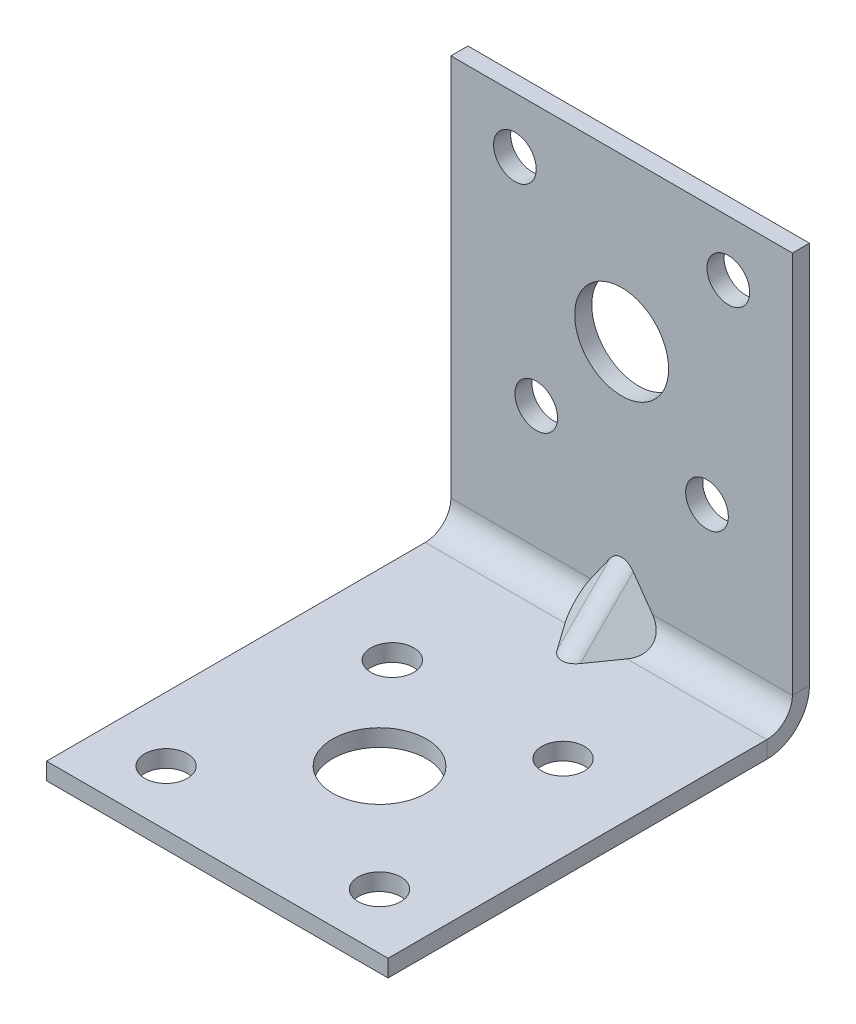
ISO-10303-21;
HEADER;
FILE_DESCRIPTION(('STEP AP214'),'2;1');
FILE_NAME('part.step','',(''),(''),'','','');
FILE_SCHEMA(('AUTOMOTIVE_DESIGN { 1 0 10303 214 1 1 1 1 }'));
ENDSEC;
DATA;
#1=APPLICATION_CONTEXT('core data for automotive mechanical design processes');
#2=APPLICATION_PROTOCOL_DEFINITION('international standard','automotive_design',2000,#1);
#3=PRODUCT_CONTEXT('',#1,'mechanical');
#4=PRODUCT('Part','Part','',(#3));
#5=PRODUCT_RELATED_PRODUCT_CATEGORY('part','',(#4));
#6=PRODUCT_DEFINITION_FORMATION('','',#4);
#7=PRODUCT_DEFINITION_CONTEXT('part definition',#1,'design');
#8=PRODUCT_DEFINITION('design','',#6,#7);
#9=PRODUCT_DEFINITION_SHAPE('','',#8);
#10=(LENGTH_UNIT() NAMED_UNIT(*) SI_UNIT(.MILLI.,.METRE.));
#11=(NAMED_UNIT(*) PLANE_ANGLE_UNIT() SI_UNIT($,.RADIAN.));
#12=(NAMED_UNIT(*) SI_UNIT($,.STERADIAN.) SOLID_ANGLE_UNIT());
#13=UNCERTAINTY_MEASURE_WITH_UNIT(LENGTH_MEASURE(1.E-05),#10,'distance_accuracy_value','');
#14=(GEOMETRIC_REPRESENTATION_CONTEXT(3) GLOBAL_UNCERTAINTY_ASSIGNED_CONTEXT((#13)) GLOBAL_UNIT_ASSIGNED_CONTEXT((#10,
#11,#12)) REPRESENTATION_CONTEXT('',''));
#15=CARTESIAN_POINT('',(0.,0.,0.));
#16=DIRECTION('',(0.,0.,1.));
#17=DIRECTION('',(1.,0.,0.));
#18=AXIS2_PLACEMENT_3D('',#15,#16,#17);
#19=CARTESIAN_POINT('',(0.,0.108407346410232,-1.60840734641019));
#20=DIRECTION('',(0.,0.,-1.));
#21=DIRECTION('',(0.,1.,0.));
#22=AXIS2_PLACEMENT_3D('',#19,#20,#21);
#23=PLANE('',#22);
#24=CARTESIAN_POINT('',(10.,17.3584073464102,-1.60840734641019));
#25=DIRECTION('',(0.,0.,1.));
#26=DIRECTION('',(1.,0.,0.));
#27=AXIS2_PLACEMENT_3D('',#24,#25,#26);
#28=CIRCLE('',#27,2.5);
#29=CARTESIAN_POINT('',(12.5,17.3584073464102,-1.60840734641019));
#30=VERTEX_POINT('',#29);
#31=EDGE_CURVE('E272',#30,#30,#28,.T.);
#32=ORIENTED_EDGE('',*,*,#31,.T.);
#33=EDGE_LOOP('',(#32));
#34=FACE_BOUND('',#33,.T.);
#35=CARTESIAN_POINT('',(-10.,17.3584073464102,-1.60840734641019));
#36=DIRECTION('',(0.,0.,1.));
#37=DIRECTION('',(1.,0.,0.));
#38=AXIS2_PLACEMENT_3D('',#35,#36,#37);
#39=CIRCLE('',#38,2.5);
#40=CARTESIAN_POINT('',(-7.5,17.3584073464102,-1.60840734641019));
#41=VERTEX_POINT('',#40);
#42=EDGE_CURVE('E297',#41,#41,#39,.T.);
#43=ORIENTED_EDGE('',*,*,#42,.T.);
#44=EDGE_LOOP('',(#43));
#45=FACE_BOUND('',#44,.T.);
#46=CARTESIAN_POINT('',(-12.5,41.3584073464102,-1.60840734641019));
#47=DIRECTION('',(0.,0.,1.));
#48=DIRECTION('',(1.,0.,0.));
#49=AXIS2_PLACEMENT_3D('',#46,#47,#48);
#50=CIRCLE('',#49,2.5);
#51=CARTESIAN_POINT('',(-10.,41.3584073464102,-1.60840734641019));
#52=VERTEX_POINT('',#51);
#53=EDGE_CURVE('E289',#52,#52,#50,.T.);
#54=ORIENTED_EDGE('',*,*,#53,.T.);
#55=EDGE_LOOP('',(#54));
#56=FACE_BOUND('',#55,.T.);
#57=CARTESIAN_POINT('',(12.5,41.3584073464102,-1.60840734641019));
#58=DIRECTION('',(0.,0.,1.));
#59=DIRECTION('',(1.,0.,0.));
#60=AXIS2_PLACEMENT_3D('',#57,#58,#59);
#61=CIRCLE('',#60,2.5);
#62=CARTESIAN_POINT('',(15.,41.3584073464102,-1.60840734641019));
#63=VERTEX_POINT('',#62);
#64=EDGE_CURVE('E281',#63,#63,#61,.T.);
#65=ORIENTED_EDGE('',*,*,#64,.T.);
#66=EDGE_LOOP('',(#65));
#67=FACE_BOUND('',#66,.T.);
#68=CARTESIAN_POINT('',(0.,28.8584073464102,-1.60840734641019));
#69=DIRECTION('',(0.,0.,1.));
#70=DIRECTION('',(1.,0.,0.));
#71=AXIS2_PLACEMENT_3D('',#68,#69,#70);
#72=CIRCLE('',#71,5.5);
#73=CARTESIAN_POINT('',(5.5,28.8584073464102,-1.60840734641019));
#74=VERTEX_POINT('',#73);
#75=EDGE_CURVE('E308',#74,#74,#72,.T.);
#76=ORIENTED_EDGE('',*,*,#75,.T.);
#77=EDGE_LOOP('',(#76));
#78=FACE_BOUND('',#77,.T.);
#79=DIRECTION('',(1.,0.,0.));
#80=VECTOR('',#79,1.);
#81=CARTESIAN_POINT('',(0.,3.00000000000002,-1.60840734641018));
#82=LINE('',#81,#80);
#83=CARTESIAN_POINT('',(3.62867965644033,3.00000000000002,-1.60840734641018));
#84=VERTEX_POINT('',#83);
#85=CARTESIAN_POINT('',(20.,3.00000000000001,-1.60840734641019));
#86=VERTEX_POINT('',#85);
#87=EDGE_CURVE('E391',#84,#86,#82,.T.);
#88=ORIENTED_EDGE('',*,*,#87,.F.);
#89=DIRECTION('',(0.577350269189627,-0.816496580927725,0.));
#90=VECTOR('',#89,1.);
#91=CARTESIAN_POINT('',(3.78222962014858,2.78284755882192,-1.60840734641018));
#92=LINE('',#91,#90);
#93=CARTESIAN_POINT('',(0.659009742330239,7.19974746830585,-1.60840734641017));
#94=VERTEX_POINT('',#93);
#95=EDGE_CURVE('E195',#84,#94,#92,.F.);
#96=ORIENTED_EDGE('',*,*,#95,.T.);
#97=CARTESIAN_POINT('',(0.,6.26776695296642,-1.60840734641017));
#98=DIRECTION('',(0.,0.,-1.));
#99=DIRECTION('',(0.,-1.,0.));
#100=AXIS2_PLACEMENT_3D('',#97,#98,#99);
#101=ELLIPSE('',#100,1.31801948466048,0.931980515339427);
#102=CARTESIAN_POINT('',(-0.659009742330244,7.19974746830585,-1.60840734641017));
#103=VERTEX_POINT('',#102);
#104=EDGE_CURVE('E199',#103,#94,#101,.T.);
#105=ORIENTED_EDGE('',*,*,#104,.F.);
#106=DIRECTION('',(0.577350269189627,0.816496580927725,0.));
#107=VECTOR('',#106,1.);
#108=CARTESIAN_POINT('',(-3.78222962014859,2.78284755882193,-1.60840734641018));
#109=LINE('',#108,#107);
#110=CARTESIAN_POINT('',(-3.62867965644035,3.00000000000002,-1.60840734641018));
#111=VERTEX_POINT('',#110);
#112=EDGE_CURVE('E179',#111,#103,#109,.T.);
#113=ORIENTED_EDGE('',*,*,#112,.F.);
#114=CARTESIAN_POINT('',(-20.,3.00000000000002,-1.60840734641018));
#115=VERTEX_POINT('',#114);
#116=EDGE_CURVE('E396',#115,#111,#82,.T.);
#117=ORIENTED_EDGE('',*,*,#116,.F.);
#118=DIRECTION('',(0.,-1.,0.));
#119=VECTOR('',#118,1.);
#120=CARTESIAN_POINT('',(-20.,-47.6415926535898,-1.60840734641036));
#121=LINE('',#120,#119);
#122=CARTESIAN_POINT('',(-20.,47.8584073464102,-1.60840734641003));
#123=VERTEX_POINT('',#122);
#124=EDGE_CURVE('E381',#123,#115,#121,.T.);
#125=ORIENTED_EDGE('',*,*,#124,.F.);
#126=DIRECTION('',(-1.,0.,0.));
#127=VECTOR('',#126,1.);
#128=CARTESIAN_POINT('',(-20.,47.8584073464102,-1.60840734641003));
#129=LINE('',#128,#127);
#130=CARTESIAN_POINT('',(20.,47.8584073464102,-1.60840734641003));
#131=VERTEX_POINT('',#130);
#132=EDGE_CURVE('E377',#131,#123,#129,.T.);
#133=ORIENTED_EDGE('',*,*,#132,.F.);
#134=DIRECTION('',(0.,1.,0.));
#135=VECTOR('',#134,1.);
#136=CARTESIAN_POINT('',(20.,-47.6415926535898,-1.60840734641036));
#137=LINE('',#136,#135);
#138=EDGE_CURVE('E382',#86,#131,#137,.T.);
#139=ORIENTED_EDGE('',*,*,#138,.F.);
#140=EDGE_LOOP('',(#88,#96,#105,#113,#117,#125,#133,#139));
#141=FACE_BOUND('',#140,.T.);
#142=ADVANCED_FACE('F54',(#34,#45,#56,#67,#78,#141),#23,.T.);
#143=CARTESIAN_POINT('',(0.,-2.,0.));
#144=DIRECTION('',(0.,-1.,0.));
#145=DIRECTION('',(0.,0.,-1.));
#146=AXIS2_PLACEMENT_3D('',#143,#144,#145);
#147=PLANE('',#146);
#148=CARTESIAN_POINT('',(-12.5,-2.,41.25));
#149=DIRECTION('',(0.,1.,0.));
#150=DIRECTION('',(0.,0.,1.));
#151=AXIS2_PLACEMENT_3D('',#148,#149,#150);
#152=CIRCLE('',#151,2.5);
#153=CARTESIAN_POINT('',(-12.5,-2.,43.75));
#154=VERTEX_POINT('',#153);
#155=EDGE_CURVE('E235',#154,#154,#152,.T.);
#156=ORIENTED_EDGE('',*,*,#155,.T.);
#157=EDGE_LOOP('',(#156));
#158=FACE_BOUND('',#157,.T.);
#159=CARTESIAN_POINT('',(12.5,-2.,41.25));
#160=DIRECTION('',(0.,1.,0.));
#161=DIRECTION('',(0.,0.,1.));
#162=AXIS2_PLACEMENT_3D('',#159,#160,#161);
#163=CIRCLE('',#162,2.5);
#164=CARTESIAN_POINT('',(12.5,-2.,43.75));
#165=VERTEX_POINT('',#164);
#166=EDGE_CURVE('E257',#165,#165,#163,.T.);
#167=ORIENTED_EDGE('',*,*,#166,.T.);
#168=EDGE_LOOP('',(#167));
#169=FACE_BOUND('',#168,.T.);
#170=CARTESIAN_POINT('',(10.,-2.,17.25));
#171=DIRECTION('',(0.,1.,0.));
#172=DIRECTION('',(0.,0.,1.));
#173=AXIS2_PLACEMENT_3D('',#170,#171,#172);
#174=CIRCLE('',#173,2.5);
#175=CARTESIAN_POINT('',(10.,-2.,19.75));
#176=VERTEX_POINT('',#175);
#177=EDGE_CURVE('E249',#176,#176,#174,.T.);
#178=ORIENTED_EDGE('',*,*,#177,.T.);
#179=EDGE_LOOP('',(#178));
#180=FACE_BOUND('',#179,.T.);
#181=CARTESIAN_POINT('',(0.,-2.,28.75));
#182=DIRECTION('',(0.,1.,0.));
#183=DIRECTION('',(0.,0.,1.));
#184=AXIS2_PLACEMENT_3D('',#181,#182,#183);
#185=CIRCLE('',#184,5.5);
#186=CARTESIAN_POINT('',(0.,-2.,34.25));
#187=VERTEX_POINT('',#186);
#188=EDGE_CURVE('E241',#187,#187,#185,.T.);
#189=ORIENTED_EDGE('',*,*,#188,.T.);
#190=EDGE_LOOP('',(#189));
#191=FACE_BOUND('',#190,.T.);
#192=CARTESIAN_POINT('',(-10.,-2.,17.25));
#193=DIRECTION('',(0.,1.,0.));
#194=DIRECTION('',(0.,0.,1.));
#195=AXIS2_PLACEMENT_3D('',#192,#193,#194);
#196=CIRCLE('',#195,2.5);
#197=CARTESIAN_POINT('',(-10.,-2.,19.75));
#198=VERTEX_POINT('',#197);
#199=EDGE_CURVE('E268',#198,#198,#196,.T.);
#200=ORIENTED_EDGE('',*,*,#199,.T.);
#201=EDGE_LOOP('',(#200));
#202=FACE_BOUND('',#201,.T.);
#203=CARTESIAN_POINT('',(0.,-2.,6.65935960655622));
#204=DIRECTION('',(0.,-1.,0.));
#205=DIRECTION('',(0.,0.,1.));
#206=AXIS2_PLACEMENT_3D('',#203,#204,#205);
#207=ELLIPSE('',#206,1.31801948466048,0.931980515339427);
#208=CARTESIAN_POINT('',(0.659009742330239,-2.,7.59134012189565));
#209=VERTEX_POINT('',#208);
#210=CARTESIAN_POINT('',(-0.659009742330245,-2.,7.59134012189564));
#211=VERTEX_POINT('',#210);
#212=EDGE_CURVE('E13',#209,#211,#207,.T.);
#213=ORIENTED_EDGE('',*,*,#212,.F.);
#214=DIRECTION('',(-0.577350269189627,0.,0.816496580927725));
#215=VECTOR('',#214,1.);
#216=CARTESIAN_POINT('',(4.01793188054411,-2.,2.84110687907837));
#217=LINE('',#216,#215);
#218=CARTESIAN_POINT('',(3.62867965644033,-2.,3.39159265358981));
#219=VERTEX_POINT('',#218);
#220=EDGE_CURVE('E189',#209,#219,#217,.F.);
#221=ORIENTED_EDGE('',*,*,#220,.T.);
#222=DIRECTION('',(1.,0.,0.));
#223=VECTOR('',#222,1.);
#224=CARTESIAN_POINT('',(0.,-2.,3.39159265358981));
#225=LINE('',#224,#223);
#226=CARTESIAN_POINT('',(20.,-2.,3.39159265358981));
#227=VERTEX_POINT('',#226);
#228=EDGE_CURVE('E365',#219,#227,#225,.T.);
#229=ORIENTED_EDGE('',*,*,#228,.T.);
#230=DIRECTION('',(0.,0.,-1.));
#231=VECTOR('',#230,1.);
#232=CARTESIAN_POINT('',(20.,-2.,47.75));
#233=LINE('',#232,#231);
#234=CARTESIAN_POINT('',(20.,-2.,47.75));
#235=VERTEX_POINT('',#234);
#236=EDGE_CURVE('E359',#235,#227,#233,.T.);
#237=ORIENTED_EDGE('',*,*,#236,.F.);
#238=DIRECTION('',(1.,0.,0.));
#239=VECTOR('',#238,1.);
#240=CARTESIAN_POINT('',(-20.,-2.,47.75));
#241=LINE('',#240,#239);
#242=CARTESIAN_POINT('',(-20.,-2.,47.75));
#243=VERTEX_POINT('',#242);
#244=EDGE_CURVE('E369',#243,#235,#241,.T.);
#245=ORIENTED_EDGE('',*,*,#244,.F.);
#246=DIRECTION('',(0.,0.,1.));
#247=VECTOR('',#246,1.);
#248=CARTESIAN_POINT('',(-20.,-2.,47.75));
#249=LINE('',#248,#247);
#250=CARTESIAN_POINT('',(-20.,-2.,3.39159265358981));
#251=VERTEX_POINT('',#250);
#252=EDGE_CURVE('E337',#251,#243,#249,.T.);
#253=ORIENTED_EDGE('',*,*,#252,.F.);
#254=CARTESIAN_POINT('',(-3.62867965644035,-2.,3.39159265358981));
#255=VERTEX_POINT('',#254);
#256=EDGE_CURVE('E185',#251,#255,#225,.T.);
#257=ORIENTED_EDGE('',*,*,#256,.T.);
#258=DIRECTION('',(-0.577350269189627,0.,-0.816496580927725));
#259=VECTOR('',#258,1.);
#260=CARTESIAN_POINT('',(-4.01793188054412,-2.,2.84110687907837));
#261=LINE('',#260,#259);
#262=EDGE_CURVE('E70',#211,#255,#261,.T.);
#263=ORIENTED_EDGE('',*,*,#262,.F.);
#264=EDGE_LOOP('',(#213,#221,#229,#237,#245,#253,#257,#263));
#265=FACE_BOUND('',#264,.T.);
#266=ADVANCED_FACE('F183',(#158,#169,#180,#191,#202,#265),#147,.T.);
#267=CARTESIAN_POINT('',(-40.5398374146266,3.,3.39159265358981));
#268=DIRECTION('',(1.,0.,0.));
#269=DIRECTION('',(0.,0.,-1.));
#270=AXIS2_PLACEMENT_3D('',#267,#268,#269);
#271=CYLINDRICAL_SURFACE('',#270,5.);
#272=ORIENTED_EDGE('',*,*,#228,.F.);
#273=CARTESIAN_POINT('',(0.0931457505075964,3.,3.39159265358981));
#274=DIRECTION('',(0.707106781186547,0.5,0.500000000000001));
#275=DIRECTION('',(0.707106781186548,-0.499999999999999,-0.5));
#276=AXIS2_PLACEMENT_3D('',#273,#274,#275);
#277=ELLIPSE('',#276,7.07106781186548,5.);
#278=EDGE_CURVE('E63',#219,#84,#277,.T.);
#279=ORIENTED_EDGE('',*,*,#278,.T.);
#280=ORIENTED_EDGE('',*,*,#87,.T.);
#281=CARTESIAN_POINT('',(20.,3.,3.39159265358981));
#282=DIRECTION('',(-1.,0.,0.));
#283=DIRECTION('',(0.,0.,-1.));
#284=AXIS2_PLACEMENT_3D('',#281,#282,#283);
#285=CIRCLE('',#284,5.);
#286=EDGE_CURVE('E320',#86,#227,#285,.T.);
#287=ORIENTED_EDGE('',*,*,#286,.T.);
#288=EDGE_LOOP('',(#272,#279,#280,#287));
#289=FACE_BOUND('',#288,.T.);
#290=ADVANCED_FACE('F429',(#289),#271,.T.);
#291=CARTESIAN_POINT('',(0.,0.108407346410225,0.391592653589806));
#292=DIRECTION('',(0.,0.,-1.));
#293=DIRECTION('',(0.,1.,0.));
#294=AXIS2_PLACEMENT_3D('',#291,#292,#293);
#295=PLANE('',#294);
#296=CARTESIAN_POINT('',(0.,28.8584073464102,0.391592653589806));
#297=DIRECTION('',(0.,0.,1.));
#298=DIRECTION('',(1.,0.,0.));
#299=AXIS2_PLACEMENT_3D('',#296,#297,#298);
#300=CIRCLE('',#299,5.5);
#301=CARTESIAN_POINT('',(5.5,28.8584073464102,0.391592653589806));
#302=VERTEX_POINT('',#301);
#303=EDGE_CURVE('E280',#302,#302,#300,.T.);
#304=ORIENTED_EDGE('',*,*,#303,.F.);
#305=EDGE_LOOP('',(#304));
#306=FACE_BOUND('',#305,.T.);
#307=CARTESIAN_POINT('',(12.5,41.3584073464102,0.391592653589806));
#308=DIRECTION('',(0.,0.,1.));
#309=DIRECTION('',(1.,0.,0.));
#310=AXIS2_PLACEMENT_3D('',#307,#308,#309);
#311=CIRCLE('',#310,2.5);
#312=CARTESIAN_POINT('',(15.,41.3584073464102,0.391592653589806));
#313=VERTEX_POINT('',#312);
#314=EDGE_CURVE('E276',#313,#313,#311,.T.);
#315=ORIENTED_EDGE('',*,*,#314,.F.);
#316=EDGE_LOOP('',(#315));
#317=FACE_BOUND('',#316,.T.);
#318=CARTESIAN_POINT('',(-12.5,41.3584073464102,0.391592653589806));
#319=DIRECTION('',(0.,0.,1.));
#320=DIRECTION('',(1.,0.,0.));
#321=AXIS2_PLACEMENT_3D('',#318,#319,#320);
#322=CIRCLE('',#321,2.5);
#323=CARTESIAN_POINT('',(-10.,41.3584073464102,0.391592653589806));
#324=VERTEX_POINT('',#323);
#325=EDGE_CURVE('E285',#324,#324,#322,.T.);
#326=ORIENTED_EDGE('',*,*,#325,.F.);
#327=EDGE_LOOP('',(#326));
#328=FACE_BOUND('',#327,.T.);
#329=CARTESIAN_POINT('',(-10.,17.3584073464102,0.391592653589806));
#330=DIRECTION('',(0.,0.,1.));
#331=DIRECTION('',(1.,0.,0.));
#332=AXIS2_PLACEMENT_3D('',#329,#330,#331);
#333=CIRCLE('',#332,2.5);
#334=CARTESIAN_POINT('',(-7.5,17.3584073464102,0.391592653589806));
#335=VERTEX_POINT('',#334);
#336=EDGE_CURVE('E293',#335,#335,#333,.T.);
#337=ORIENTED_EDGE('',*,*,#336,.F.);
#338=EDGE_LOOP('',(#337));
#339=FACE_BOUND('',#338,.T.);
#340=CARTESIAN_POINT('',(10.,17.3584073464102,0.391592653589806));
#341=DIRECTION('',(0.,0.,1.));
#342=DIRECTION('',(1.,0.,0.));
#343=AXIS2_PLACEMENT_3D('',#340,#341,#342);
#344=CIRCLE('',#343,2.5);
#345=CARTESIAN_POINT('',(12.5,17.3584073464102,0.391592653589806));
#346=VERTEX_POINT('',#345);
#347=EDGE_CURVE('E301',#346,#346,#344,.T.);
#348=ORIENTED_EDGE('',*,*,#347,.F.);
#349=EDGE_LOOP('',(#348));
#350=FACE_BOUND('',#349,.T.);
#351=DIRECTION('',(0.577350269189627,-0.816496580927725,0.));
#352=VECTOR('',#351,1.);
#353=CARTESIAN_POINT('',(3.78222962014858,2.78284755882192,0.391592653589816));
#354=LINE('',#353,#352);
#355=CARTESIAN_POINT('',(3.62867965644034,3.00000000000001,0.391592653589816));
#356=VERTEX_POINT('',#355);
#357=CARTESIAN_POINT('',(1.36611652351679,6.19974746830585,0.391592653589827));
#358=VERTEX_POINT('',#357);
#359=EDGE_CURVE('E224',#356,#358,#354,.F.);
#360=ORIENTED_EDGE('',*,*,#359,.F.);
#361=DIRECTION('',(1.,0.,0.));
#362=VECTOR('',#361,1.);
#363=CARTESIAN_POINT('',(0.,3.00000000000001,0.391592653589817));
#364=LINE('',#363,#362);
#365=CARTESIAN_POINT('',(20.,3.00000000000001,0.391592653589817));
#366=VERTEX_POINT('',#365);
#367=EDGE_CURVE('E404',#356,#366,#364,.T.);
#368=ORIENTED_EDGE('',*,*,#367,.T.);
#369=DIRECTION('',(0.,1.,0.));
#370=VECTOR('',#369,1.);
#371=CARTESIAN_POINT('',(20.,-47.6415926535898,0.39159265358964));
#372=LINE('',#371,#370);
#373=CARTESIAN_POINT('',(20.,47.8584073464102,0.391592653589973));
#374=VERTEX_POINT('',#373);
#375=EDGE_CURVE('E336',#366,#374,#372,.T.);
#376=ORIENTED_EDGE('',*,*,#375,.T.);
#377=DIRECTION('',(-1.,0.,0.));
#378=VECTOR('',#377,1.);
#379=CARTESIAN_POINT('',(-20.,47.8584073464102,0.391592653589973));
#380=LINE('',#379,#378);
#381=CARTESIAN_POINT('',(-20.,47.8584073464102,0.391592653589973));
#382=VERTEX_POINT('',#381);
#383=EDGE_CURVE('E383',#374,#382,#380,.T.);
#384=ORIENTED_EDGE('',*,*,#383,.T.);
#385=DIRECTION('',(0.,-1.,0.));
#386=VECTOR('',#385,1.);
#387=CARTESIAN_POINT('',(-20.,-47.6415926535898,0.39159265358964));
#388=LINE('',#387,#386);
#389=CARTESIAN_POINT('',(-20.,3.00000000000001,0.391592653589817));
#390=VERTEX_POINT('',#389);
#391=EDGE_CURVE('E387',#382,#390,#388,.T.);
#392=ORIENTED_EDGE('',*,*,#391,.T.);
#393=CARTESIAN_POINT('',(-3.62867965644035,3.00000000000001,0.391592653589816));
#394=VERTEX_POINT('',#393);
#395=EDGE_CURVE('E405',#390,#394,#364,.T.);
#396=ORIENTED_EDGE('',*,*,#395,.T.);
#397=DIRECTION('',(0.577350269189627,0.816496580927725,0.));
#398=VECTOR('',#397,1.);
#399=CARTESIAN_POINT('',(-3.78222962014859,2.78284755882192,0.391592653589816));
#400=LINE('',#399,#398);
#401=CARTESIAN_POINT('',(-1.36611652351679,6.19974746830585,0.391592653589827));
#402=VERTEX_POINT('',#401);
#403=EDGE_CURVE('E78',#394,#402,#400,.T.);
#404=ORIENTED_EDGE('',*,*,#403,.T.);
#405=CARTESIAN_POINT('',(0.,4.26776695296642,0.391592653589821));
#406=DIRECTION('',(0.,0.,-1.));
#407=DIRECTION('',(0.,-1.,0.));
#408=AXIS2_PLACEMENT_3D('',#405,#406,#407);
#409=ELLIPSE('',#408,2.73223304703357,1.93198051533943);
#410=EDGE_CURVE('E231',#402,#358,#409,.T.);
#411=ORIENTED_EDGE('',*,*,#410,.T.);
#412=EDGE_LOOP('',(#360,#368,#376,#384,#392,#396,#404,#411));
#413=FACE_BOUND('',#412,.T.);
#414=ADVANCED_FACE('F473',(#306,#317,#328,#339,#350,#413),#295,.F.);
#415=CARTESIAN_POINT('',(0.,0.,0.));
#416=DIRECTION('',(0.,-1.,0.));
#417=DIRECTION('',(0.,0.,-1.));
#418=AXIS2_PLACEMENT_3D('',#415,#416,#417);
#419=PLANE('',#418);
#420=CARTESIAN_POINT('',(-10.,0.,17.25));
#421=DIRECTION('',(0.,1.,0.));
#422=DIRECTION('',(0.,0.,1.));
#423=AXIS2_PLACEMENT_3D('',#420,#421,#422);
#424=CIRCLE('',#423,2.5);
#425=CARTESIAN_POINT('',(-10.,0.,19.75));
#426=VERTEX_POINT('',#425);
#427=EDGE_CURVE('E240',#426,#426,#424,.T.);
#428=ORIENTED_EDGE('',*,*,#427,.F.);
#429=EDGE_LOOP('',(#428));
#430=FACE_BOUND('',#429,.T.);
#431=CARTESIAN_POINT('',(0.,0.,28.75));
#432=DIRECTION('',(0.,1.,0.));
#433=DIRECTION('',(0.,0.,1.));
#434=AXIS2_PLACEMENT_3D('',#431,#432,#433);
#435=CIRCLE('',#434,5.5);
#436=CARTESIAN_POINT('',(0.,0.,34.25));
#437=VERTEX_POINT('',#436);
#438=EDGE_CURVE('E236',#437,#437,#435,.T.);
#439=ORIENTED_EDGE('',*,*,#438,.F.);
#440=EDGE_LOOP('',(#439));
#441=FACE_BOUND('',#440,.T.);
#442=CARTESIAN_POINT('',(10.,0.,17.25));
#443=DIRECTION('',(0.,1.,0.));
#444=DIRECTION('',(0.,0.,1.));
#445=AXIS2_PLACEMENT_3D('',#442,#443,#444);
#446=CIRCLE('',#445,2.5);
#447=CARTESIAN_POINT('',(10.,0.,19.75));
#448=VERTEX_POINT('',#447);
#449=EDGE_CURVE('E245',#448,#448,#446,.T.);
#450=ORIENTED_EDGE('',*,*,#449,.F.);
#451=EDGE_LOOP('',(#450));
#452=FACE_BOUND('',#451,.T.);
#453=CARTESIAN_POINT('',(12.5,0.,41.25));
#454=DIRECTION('',(0.,1.,0.));
#455=DIRECTION('',(0.,0.,1.));
#456=AXIS2_PLACEMENT_3D('',#453,#454,#455);
#457=CIRCLE('',#456,2.5);
#458=CARTESIAN_POINT('',(12.5,0.,43.75));
#459=VERTEX_POINT('',#458);
#460=EDGE_CURVE('E253',#459,#459,#457,.T.);
#461=ORIENTED_EDGE('',*,*,#460,.F.);
#462=EDGE_LOOP('',(#461));
#463=FACE_BOUND('',#462,.T.);
#464=CARTESIAN_POINT('',(-12.5,0.,41.25));
#465=DIRECTION('',(0.,1.,0.));
#466=DIRECTION('',(0.,0.,1.));
#467=AXIS2_PLACEMENT_3D('',#464,#465,#466);
#468=CIRCLE('',#467,2.5);
#469=CARTESIAN_POINT('',(-12.5,0.,43.75));
#470=VERTEX_POINT('',#469);
#471=EDGE_CURVE('E261',#470,#470,#468,.T.);
#472=ORIENTED_EDGE('',*,*,#471,.F.);
#473=EDGE_LOOP('',(#472));
#474=FACE_BOUND('',#473,.T.);
#475=DIRECTION('',(-0.577350269189627,0.,0.816496580927725));
#476=VECTOR('',#475,1.);
#477=CARTESIAN_POINT('',(4.01793188054411,0.,2.84110687907837));
#478=LINE('',#477,#476);
#479=CARTESIAN_POINT('',(1.36611652351678,0.,6.59134012189565));
#480=VERTEX_POINT('',#479);
#481=CARTESIAN_POINT('',(3.62867965644034,0.,3.39159265358981));
#482=VERTEX_POINT('',#481);
#483=EDGE_CURVE('E221',#480,#482,#478,.F.);
#484=ORIENTED_EDGE('',*,*,#483,.F.);
#485=CARTESIAN_POINT('',(0.,0.,4.65935960655623));
#486=DIRECTION('',(0.,-1.,0.));
#487=DIRECTION('',(0.,0.,1.));
#488=AXIS2_PLACEMENT_3D('',#485,#486,#487);
#489=ELLIPSE('',#488,2.73223304703358,1.93198051533943);
#490=CARTESIAN_POINT('',(-1.36611652351679,0.,6.59134012189565));
#491=VERTEX_POINT('',#490);
#492=EDGE_CURVE('E227',#480,#491,#489,.T.);
#493=ORIENTED_EDGE('',*,*,#492,.T.);
#494=DIRECTION('',(-0.577350269189627,0.,-0.816496580927725));
#495=VECTOR('',#494,1.);
#496=CARTESIAN_POINT('',(-4.01793188054412,0.,2.84110687907837));
#497=LINE('',#496,#495);
#498=CARTESIAN_POINT('',(-3.62867965644035,0.,3.39159265358981));
#499=VERTEX_POINT('',#498);
#500=EDGE_CURVE('E212',#491,#499,#497,.T.);
#501=ORIENTED_EDGE('',*,*,#500,.T.);
#502=DIRECTION('',(1.,0.,0.));
#503=VECTOR('',#502,1.);
#504=CARTESIAN_POINT('',(0.,0.,3.39159265358981));
#505=LINE('',#504,#503);
#506=CARTESIAN_POINT('',(-20.,0.,3.39159265358981));
#507=VERTEX_POINT('',#506);
#508=EDGE_CURVE('E373',#507,#499,#505,.T.);
#509=ORIENTED_EDGE('',*,*,#508,.F.);
#510=DIRECTION('',(0.,0.,1.));
#511=VECTOR('',#510,1.);
#512=CARTESIAN_POINT('',(-20.,0.,47.75));
#513=LINE('',#512,#511);
#514=CARTESIAN_POINT('',(-20.,0.,47.75));
#515=VERTEX_POINT('',#514);
#516=EDGE_CURVE('E352',#507,#515,#513,.T.);
#517=ORIENTED_EDGE('',*,*,#516,.T.);
#518=DIRECTION('',(1.,0.,0.));
#519=VECTOR('',#518,1.);
#520=CARTESIAN_POINT('',(-20.,0.,47.75));
#521=LINE('',#520,#519);
#522=CARTESIAN_POINT('',(20.,0.,47.75));
#523=VERTEX_POINT('',#522);
#524=EDGE_CURVE('E348',#515,#523,#521,.T.);
#525=ORIENTED_EDGE('',*,*,#524,.T.);
#526=DIRECTION('',(0.,0.,-1.));
#527=VECTOR('',#526,1.);
#528=CARTESIAN_POINT('',(20.,0.,47.75));
#529=LINE('',#528,#527);
#530=CARTESIAN_POINT('',(20.,0.,3.39159265358981));
#531=VERTEX_POINT('',#530);
#532=EDGE_CURVE('E344',#523,#531,#529,.T.);
#533=ORIENTED_EDGE('',*,*,#532,.T.);
#534=EDGE_CURVE('E325',#482,#531,#505,.T.);
#535=ORIENTED_EDGE('',*,*,#534,.F.);
#536=EDGE_LOOP('',(#484,#493,#501,#509,#517,#525,#533,#535));
#537=FACE_BOUND('',#536,.T.);
#538=ADVANCED_FACE('F451',(#430,#441,#452,#463,#474,#537),#419,.F.);
#539=CARTESIAN_POINT('',(-40.5398374146266,3.,3.39159265358981));
#540=DIRECTION('',(1.,0.,0.));
#541=DIRECTION('',(0.,0.,-1.));
#542=AXIS2_PLACEMENT_3D('',#539,#540,#541);
#543=CYLINDRICAL_SURFACE('',#542,3.);
#544=CARTESIAN_POINT('',(1.5073593128807,3.,3.39159265358981));
#545=DIRECTION('',(0.707106781186547,0.5,0.500000000000001));
#546=DIRECTION('',(0.707106781186548,-0.499999999999999,-0.5));
#547=AXIS2_PLACEMENT_3D('',#544,#545,#546);
#548=ELLIPSE('',#547,4.24264068711929,3.);
#549=EDGE_CURVE('E218',#482,#356,#548,.T.);
#550=ORIENTED_EDGE('',*,*,#549,.F.);
#551=ORIENTED_EDGE('',*,*,#534,.T.);
#552=CARTESIAN_POINT('',(20.,3.,3.39159265358981));
#553=DIRECTION('',(1.,0.,0.));
#554=DIRECTION('',(0.,0.,-1.));
#555=AXIS2_PLACEMENT_3D('',#552,#553,#554);
#556=CIRCLE('',#555,3.);
#557=EDGE_CURVE('E321',#366,#531,#556,.F.);
#558=ORIENTED_EDGE('',*,*,#557,.F.);
#559=ORIENTED_EDGE('',*,*,#367,.F.);
#560=EDGE_LOOP('',(#550,#551,#558,#559));
#561=FACE_BOUND('',#560,.T.);
#562=ADVANCED_FACE('F443',(#561),#543,.F.);
#563=CARTESIAN_POINT('',(20.,-47.6415926535898,-1.60840734641036));
#564=DIRECTION('',(1.,0.,0.));
#565=DIRECTION('',(0.,1.,0.));
#566=AXIS2_PLACEMENT_3D('',#563,#564,#565);
#567=PLANE('',#566);
#568=DIRECTION('',(0.,0.,1.));
#569=VECTOR('',#568,1.);
#570=CARTESIAN_POINT('',(20.,3.00000000000002,-1.60840734641019));
#571=LINE('',#570,#569);
#572=EDGE_CURVE('E400',#86,#366,#571,.T.);
#573=ORIENTED_EDGE('',*,*,#572,.F.);
#574=ORIENTED_EDGE('',*,*,#138,.T.);
#575=DIRECTION('',(0.,0.,1.));
#576=VECTOR('',#575,1.);
#577=CARTESIAN_POINT('',(20.,47.8584073464102,-1.60840734641003));
#578=LINE('',#577,#576);
#579=EDGE_CURVE('E392',#131,#374,#578,.T.);
#580=ORIENTED_EDGE('',*,*,#579,.T.);
#581=ORIENTED_EDGE('',*,*,#375,.F.);
#582=EDGE_LOOP('',(#573,#574,#580,#581));
#583=FACE_BOUND('',#582,.T.);
#584=ADVANCED_FACE('F505',(#583),#567,.T.);
#585=CARTESIAN_POINT('',(-20.,-47.6415926535898,-1.60840734641036));
#586=DIRECTION('',(-1.,0.,0.));
#587=DIRECTION('',(0.,-1.,0.));
#588=AXIS2_PLACEMENT_3D('',#585,#586,#587);
#589=PLANE('',#588);
#590=DIRECTION('',(0.,0.,-1.));
#591=VECTOR('',#590,1.);
#592=CARTESIAN_POINT('',(-20.,3.00000000000002,-1.60840734641019));
#593=LINE('',#592,#591);
#594=EDGE_CURVE('E409',#390,#115,#593,.T.);
#595=ORIENTED_EDGE('',*,*,#594,.F.);
#596=ORIENTED_EDGE('',*,*,#391,.F.);
#597=DIRECTION('',(0.,0.,1.));
#598=VECTOR('',#597,1.);
#599=CARTESIAN_POINT('',(-20.,47.8584073464102,-1.60840734641003));
#600=LINE('',#599,#598);
#601=EDGE_CURVE('E388',#123,#382,#600,.T.);
#602=ORIENTED_EDGE('',*,*,#601,.F.);
#603=ORIENTED_EDGE('',*,*,#124,.T.);
#604=EDGE_LOOP('',(#595,#596,#602,#603));
#605=FACE_BOUND('',#604,.T.);
#606=ADVANCED_FACE('F56',(#605),#589,.T.);
#607=CARTESIAN_POINT('',(-20.,47.8584073464102,-1.60840734641003));
#608=DIRECTION('',(0.,1.,0.));
#609=DIRECTION('',(-1.,0.,0.));
#610=AXIS2_PLACEMENT_3D('',#607,#608,#609);
#611=PLANE('',#610);
#612=ORIENTED_EDGE('',*,*,#383,.F.);
#613=ORIENTED_EDGE('',*,*,#579,.F.);
#614=ORIENTED_EDGE('',*,*,#132,.T.);
#615=ORIENTED_EDGE('',*,*,#601,.T.);
#616=EDGE_LOOP('',(#612,#613,#614,#615));
#617=FACE_BOUND('',#616,.T.);
#618=ADVANCED_FACE('F503',(#617),#611,.T.);
#619=CARTESIAN_POINT('',(-20.,-2.,47.75));
#620=DIRECTION('',(0.,0.,1.));
#621=DIRECTION('',(1.,0.,0.));
#622=AXIS2_PLACEMENT_3D('',#619,#620,#621);
#623=PLANE('',#622);
#624=ORIENTED_EDGE('',*,*,#524,.F.);
#625=DIRECTION('',(0.,1.,0.));
#626=VECTOR('',#625,1.);
#627=CARTESIAN_POINT('',(-20.,-2.,47.75));
#628=LINE('',#627,#626);
#629=EDGE_CURVE('E332',#243,#515,#628,.T.);
#630=ORIENTED_EDGE('',*,*,#629,.F.);
#631=ORIENTED_EDGE('',*,*,#244,.T.);
#632=DIRECTION('',(0.,1.,0.));
#633=VECTOR('',#632,1.);
#634=CARTESIAN_POINT('',(20.,-2.,47.75));
#635=LINE('',#634,#633);
#636=EDGE_CURVE('E366',#235,#523,#635,.T.);
#637=ORIENTED_EDGE('',*,*,#636,.T.);
#638=EDGE_LOOP('',(#624,#630,#631,#637));
#639=FACE_BOUND('',#638,.T.);
#640=ADVANCED_FACE('F459',(#639),#623,.T.);
#641=CARTESIAN_POINT('',(20.,-2.,47.75));
#642=DIRECTION('',(1.,0.,0.));
#643=DIRECTION('',(0.,0.,-1.));
#644=AXIS2_PLACEMENT_3D('',#641,#642,#643);
#645=PLANE('',#644);
#646=ORIENTED_EDGE('',*,*,#236,.T.);
#647=DIRECTION('',(0.,1.,0.));
#648=VECTOR('',#647,1.);
#649=CARTESIAN_POINT('',(20.,-2.,3.39159265358981));
#650=LINE('',#649,#648);
#651=EDGE_CURVE('E355',#227,#531,#650,.T.);
#652=ORIENTED_EDGE('',*,*,#651,.T.);
#653=ORIENTED_EDGE('',*,*,#532,.F.);
#654=ORIENTED_EDGE('',*,*,#636,.F.);
#655=EDGE_LOOP('',(#646,#652,#653,#654));
#656=FACE_BOUND('',#655,.T.);
#657=ADVANCED_FACE('F454',(#656),#645,.T.);
#658=CARTESIAN_POINT('',(-20.,-2.,47.75));
#659=DIRECTION('',(-1.,0.,0.));
#660=DIRECTION('',(0.,0.,1.));
#661=AXIS2_PLACEMENT_3D('',#658,#659,#660);
#662=PLANE('',#661);
#663=ORIENTED_EDGE('',*,*,#516,.F.);
#664=DIRECTION('',(0.,-1.,0.));
#665=VECTOR('',#664,1.);
#666=CARTESIAN_POINT('',(-20.,-2.,3.39159265358981));
#667=LINE('',#666,#665);
#668=EDGE_CURVE('E340',#507,#251,#667,.T.);
#669=ORIENTED_EDGE('',*,*,#668,.T.);
#670=ORIENTED_EDGE('',*,*,#252,.T.);
#671=ORIENTED_EDGE('',*,*,#629,.T.);
#672=EDGE_LOOP('',(#663,#669,#670,#671));
#673=FACE_BOUND('',#672,.T.);
#674=ADVANCED_FACE('F462',(#673),#662,.T.);
#675=CARTESIAN_POINT('',(-20.,3.,3.39159265358981));
#676=DIRECTION('',(-1.,0.,0.));
#677=DIRECTION('',(0.,0.,1.));
#678=AXIS2_PLACEMENT_3D('',#675,#676,#677);
#679=PLANE('',#678);
#680=ORIENTED_EDGE('',*,*,#668,.F.);
#681=CARTESIAN_POINT('',(-20.,3.,3.39159265358981));
#682=DIRECTION('',(1.,0.,0.));
#683=DIRECTION('',(0.,0.,-1.));
#684=AXIS2_PLACEMENT_3D('',#681,#682,#683);
#685=CIRCLE('',#684,3.);
#686=EDGE_CURVE('E312',#507,#390,#685,.T.);
#687=ORIENTED_EDGE('',*,*,#686,.T.);
#688=ORIENTED_EDGE('',*,*,#594,.T.);
#689=CARTESIAN_POINT('',(-20.,3.,3.39159265358981));
#690=DIRECTION('',(1.,0.,0.));
#691=DIRECTION('',(0.,0.,1.));
#692=AXIS2_PLACEMENT_3D('',#689,#690,#691);
#693=CIRCLE('',#692,5.);
#694=EDGE_CURVE('E316',#251,#115,#693,.T.);
#695=ORIENTED_EDGE('',*,*,#694,.F.);
#696=EDGE_LOOP('',(#680,#687,#688,#695));
#697=FACE_BOUND('',#696,.T.);
#698=ADVANCED_FACE('F467',(#697),#679,.T.);
#699=CARTESIAN_POINT('',(20.,3.,3.39159265358981));
#700=DIRECTION('',(1.,0.,0.));
#701=DIRECTION('',(0.,0.,-1.));
#702=AXIS2_PLACEMENT_3D('',#699,#700,#701);
#703=PLANE('',#702);
#704=ORIENTED_EDGE('',*,*,#557,.T.);
#705=ORIENTED_EDGE('',*,*,#651,.F.);
#706=ORIENTED_EDGE('',*,*,#286,.F.);
#707=ORIENTED_EDGE('',*,*,#572,.T.);
#708=EDGE_LOOP('',(#704,#705,#706,#707));
#709=FACE_BOUND('',#708,.T.);
#710=ADVANCED_FACE('F449',(#709),#703,.T.);
#711=CARTESIAN_POINT('',(-0.0931457505076103,3.,3.39159265358981));
#712=DIRECTION('',(-0.707106781186547,0.5,0.500000000000001));
#713=DIRECTION('',(0.707106781186548,0.499999999999999,0.5));
#714=AXIS2_PLACEMENT_3D('',#711,#712,#713);
#715=ELLIPSE('',#714,7.07106781186548,5.);
#716=EDGE_CURVE('E413',#255,#111,#715,.F.);
#717=ORIENTED_EDGE('',*,*,#716,.F.);
#718=ORIENTED_EDGE('',*,*,#256,.F.);
#719=ORIENTED_EDGE('',*,*,#694,.T.);
#720=ORIENTED_EDGE('',*,*,#116,.T.);
#721=EDGE_LOOP('',(#717,#718,#719,#720));
#722=FACE_BOUND('',#721,.T.);
#723=ADVANCED_FACE('F480',(#722),#271,.T.);
#724=ORIENTED_EDGE('',*,*,#508,.T.);
#725=CARTESIAN_POINT('',(-1.50735931288071,3.,3.39159265358981));
#726=DIRECTION('',(-0.707106781186547,0.5,0.500000000000001));
#727=DIRECTION('',(0.707106781186548,0.499999999999999,0.5));
#728=AXIS2_PLACEMENT_3D('',#725,#726,#727);
#729=ELLIPSE('',#728,4.24264068711929,3.);
#730=EDGE_CURVE('E209',#499,#394,#729,.F.);
#731=ORIENTED_EDGE('',*,*,#730,.T.);
#732=ORIENTED_EDGE('',*,*,#395,.F.);
#733=ORIENTED_EDGE('',*,*,#686,.F.);
#734=EDGE_LOOP('',(#724,#731,#732,#733));
#735=FACE_BOUND('',#734,.T.);
#736=ADVANCED_FACE('F470',(#735),#543,.F.);
#737=CARTESIAN_POINT('',(0.,28.8584073464102,-1.60840734641019));
#738=DIRECTION('',(0.,0.,1.));
#739=DIRECTION('',(1.,0.,0.));
#740=AXIS2_PLACEMENT_3D('',#737,#738,#739);
#741=CYLINDRICAL_SURFACE('',#740,5.5);
#742=ORIENTED_EDGE('',*,*,#75,.F.);
#743=EDGE_LOOP('',(#742));
#744=FACE_BOUND('',#743,.T.);
#745=ORIENTED_EDGE('',*,*,#303,.T.);
#746=EDGE_LOOP('',(#745));
#747=FACE_BOUND('',#746,.T.);
#748=ADVANCED_FACE('F546',(#744,#747),#741,.F.);
#749=CARTESIAN_POINT('',(12.5,41.3584073464102,-1.60840734641019));
#750=DIRECTION('',(0.,0.,1.));
#751=DIRECTION('',(1.,0.,0.));
#752=AXIS2_PLACEMENT_3D('',#749,#750,#751);
#753=CYLINDRICAL_SURFACE('',#752,2.5);
#754=ORIENTED_EDGE('',*,*,#64,.F.);
#755=EDGE_LOOP('',(#754));
#756=FACE_BOUND('',#755,.T.);
#757=ORIENTED_EDGE('',*,*,#314,.T.);
#758=EDGE_LOOP('',(#757));
#759=FACE_BOUND('',#758,.T.);
#760=ADVANCED_FACE('F548',(#756,#759),#753,.F.);
#761=CARTESIAN_POINT('',(-12.5,41.3584073464102,-1.60840734641019));
#762=DIRECTION('',(0.,0.,1.));
#763=DIRECTION('',(1.,0.,0.));
#764=AXIS2_PLACEMENT_3D('',#761,#762,#763);
#765=CYLINDRICAL_SURFACE('',#764,2.5);
#766=ORIENTED_EDGE('',*,*,#53,.F.);
#767=EDGE_LOOP('',(#766));
#768=FACE_BOUND('',#767,.T.);
#769=ORIENTED_EDGE('',*,*,#325,.T.);
#770=EDGE_LOOP('',(#769));
#771=FACE_BOUND('',#770,.T.);
#772=ADVANCED_FACE('F540',(#768,#771),#765,.F.);
#773=CARTESIAN_POINT('',(-10.,17.3584073464102,-1.60840734641019));
#774=DIRECTION('',(0.,0.,1.));
#775=DIRECTION('',(1.,0.,0.));
#776=AXIS2_PLACEMENT_3D('',#773,#774,#775);
#777=CYLINDRICAL_SURFACE('',#776,2.5);
#778=ORIENTED_EDGE('',*,*,#42,.F.);
#779=EDGE_LOOP('',(#778));
#780=FACE_BOUND('',#779,.T.);
#781=ORIENTED_EDGE('',*,*,#336,.T.);
#782=EDGE_LOOP('',(#781));
#783=FACE_BOUND('',#782,.T.);
#784=ADVANCED_FACE('F530',(#780,#783),#777,.F.);
#785=CARTESIAN_POINT('',(10.,17.3584073464102,-1.60840734641019));
#786=DIRECTION('',(0.,0.,1.));
#787=DIRECTION('',(1.,0.,0.));
#788=AXIS2_PLACEMENT_3D('',#785,#786,#787);
#789=CYLINDRICAL_SURFACE('',#788,2.5);
#790=ORIENTED_EDGE('',*,*,#31,.F.);
#791=EDGE_LOOP('',(#790));
#792=FACE_BOUND('',#791,.T.);
#793=ORIENTED_EDGE('',*,*,#347,.T.);
#794=EDGE_LOOP('',(#793));
#795=FACE_BOUND('',#794,.T.);
#796=ADVANCED_FACE('F527',(#792,#795),#789,.F.);
#797=CARTESIAN_POINT('',(-10.,-2.,17.25));
#798=DIRECTION('',(0.,1.,0.));
#799=DIRECTION('',(0.,0.,1.));
#800=AXIS2_PLACEMENT_3D('',#797,#798,#799);
#801=CYLINDRICAL_SURFACE('',#800,2.5);
#802=ORIENTED_EDGE('',*,*,#199,.F.);
#803=EDGE_LOOP('',(#802));
#804=FACE_BOUND('',#803,.T.);
#805=ORIENTED_EDGE('',*,*,#427,.T.);
#806=EDGE_LOOP('',(#805));
#807=FACE_BOUND('',#806,.T.);
#808=ADVANCED_FACE('F529',(#804,#807),#801,.F.);
#809=CARTESIAN_POINT('',(0.,-2.,28.75));
#810=DIRECTION('',(0.,1.,0.));
#811=DIRECTION('',(0.,0.,1.));
#812=AXIS2_PLACEMENT_3D('',#809,#810,#811);
#813=CYLINDRICAL_SURFACE('',#812,5.5);
#814=ORIENTED_EDGE('',*,*,#188,.F.);
#815=EDGE_LOOP('',(#814));
#816=FACE_BOUND('',#815,.T.);
#817=ORIENTED_EDGE('',*,*,#438,.T.);
#818=EDGE_LOOP('',(#817));
#819=FACE_BOUND('',#818,.T.);
#820=ADVANCED_FACE('F537',(#816,#819),#813,.F.);
#821=CARTESIAN_POINT('',(10.,-2.,17.25));
#822=DIRECTION('',(0.,1.,0.));
#823=DIRECTION('',(0.,0.,1.));
#824=AXIS2_PLACEMENT_3D('',#821,#822,#823);
#825=CYLINDRICAL_SURFACE('',#824,2.5);
#826=ORIENTED_EDGE('',*,*,#177,.F.);
#827=EDGE_LOOP('',(#826));
#828=FACE_BOUND('',#827,.T.);
#829=ORIENTED_EDGE('',*,*,#449,.T.);
#830=EDGE_LOOP('',(#829));
#831=FACE_BOUND('',#830,.T.);
#832=ADVANCED_FACE('F627',(#828,#831),#825,.F.);
#833=CARTESIAN_POINT('',(12.5,-2.,41.25));
#834=DIRECTION('',(0.,1.,0.));
#835=DIRECTION('',(0.,0.,1.));
#836=AXIS2_PLACEMENT_3D('',#833,#834,#835);
#837=CYLINDRICAL_SURFACE('',#836,2.5);
#838=ORIENTED_EDGE('',*,*,#166,.F.);
#839=EDGE_LOOP('',(#838));
#840=FACE_BOUND('',#839,.T.);
#841=ORIENTED_EDGE('',*,*,#460,.T.);
#842=EDGE_LOOP('',(#841));
#843=FACE_BOUND('',#842,.T.);
#844=ADVANCED_FACE('F638',(#840,#843),#837,.F.);
#845=CARTESIAN_POINT('',(-12.5,-2.,41.25));
#846=DIRECTION('',(0.,1.,0.));
#847=DIRECTION('',(0.,0.,1.));
#848=AXIS2_PLACEMENT_3D('',#845,#846,#847);
#849=CYLINDRICAL_SURFACE('',#848,2.5);
#850=ORIENTED_EDGE('',*,*,#155,.F.);
#851=EDGE_LOOP('',(#850));
#852=FACE_BOUND('',#851,.T.);
#853=ORIENTED_EDGE('',*,*,#471,.T.);
#854=EDGE_LOOP('',(#853));
#855=FACE_BOUND('',#854,.T.);
#856=ADVANCED_FACE('F649',(#852,#855),#849,.F.);
#857=CARTESIAN_POINT('',(0.,8.43375721063614,-3.77439760407988));
#858=DIRECTION('',(0.,-0.707106781186549,0.707106781186546));
#859=DIRECTION('',(0.,-0.707106781186546,-0.707106781186549));
#860=AXIS2_PLACEMENT_3D('',#857,#858,#859);
#861=CYLINDRICAL_SURFACE('',#860,1.93198051533943);
#862=ORIENTED_EDGE('',*,*,#410,.F.);
#863=DIRECTION('',(0.,0.707106781186549,-0.707106781186546));
#864=VECTOR('',#863,1.);
#865=CARTESIAN_POINT('',(-1.36611652351679,9.39974746830585,-2.80840734641017));
#866=LINE('',#865,#864);
#867=EDGE_CURVE('E206',#491,#402,#866,.T.);
#868=ORIENTED_EDGE('',*,*,#867,.F.);
#869=ORIENTED_EDGE('',*,*,#492,.F.);
#870=DIRECTION('',(0.,0.707106781186549,-0.707106781186546));
#871=VECTOR('',#870,1.);
#872=CARTESIAN_POINT('',(1.36611652351679,3.09987373415293,3.49146638774274));
#873=LINE('',#872,#871);
#874=EDGE_CURVE('E202',#358,#480,#873,.F.);
#875=ORIENTED_EDGE('',*,*,#874,.F.);
#876=EDGE_LOOP('',(#862,#868,#869,#875));
#877=FACE_BOUND('',#876,.T.);
#878=ADVANCED_FACE('F659',(#877),#861,.T.);
#879=CARTESIAN_POINT('',(5.75,0.,0.391592653589805));
#880=DIRECTION('',(0.707106781186547,0.5,0.500000000000001));
#881=DIRECTION('',(0.577350269189627,0.,-0.816496580927725));
#882=AXIS2_PLACEMENT_3D('',#879,#880,#881);
#883=PLANE('',#882);
#884=ORIENTED_EDGE('',*,*,#549,.T.);
#885=ORIENTED_EDGE('',*,*,#359,.T.);
#886=ORIENTED_EDGE('',*,*,#874,.T.);
#887=ORIENTED_EDGE('',*,*,#483,.T.);
#888=EDGE_LOOP('',(#884,#885,#886,#887));
#889=FACE_BOUND('',#888,.T.);
#890=ADVANCED_FACE('F818',(#889),#883,.T.);
#891=CARTESIAN_POINT('',(-5.75,0.,0.391592653589805));
#892=DIRECTION('',(-0.707106781186547,0.5,0.500000000000001));
#893=DIRECTION('',(0.577350269189627,0.,0.816496580927725));
#894=AXIS2_PLACEMENT_3D('',#891,#892,#893);
#895=PLANE('',#894);
#896=ORIENTED_EDGE('',*,*,#403,.F.);
#897=ORIENTED_EDGE('',*,*,#730,.F.);
#898=ORIENTED_EDGE('',*,*,#500,.F.);
#899=ORIENTED_EDGE('',*,*,#867,.T.);
#900=EDGE_LOOP('',(#896,#897,#898,#899));
#901=FACE_BOUND('',#900,.T.);
#902=ADVANCED_FACE('F490',(#901),#895,.T.);
#903=CARTESIAN_POINT('',(0.,8.43375721063614,-3.77439760407988));
#904=DIRECTION('',(0.,-0.707106781186549,0.707106781186546));
#905=DIRECTION('',(0.,-0.707106781186546,-0.707106781186549));
#906=AXIS2_PLACEMENT_3D('',#903,#904,#905);
#907=CYLINDRICAL_SURFACE('',#906,0.931980515339427);
#908=ORIENTED_EDGE('',*,*,#104,.T.);
#909=DIRECTION('',(0.,-0.707106781186549,0.707106781186546));
#910=VECTOR('',#909,1.);
#911=CARTESIAN_POINT('',(0.659009742330239,8.89974746830585,-3.30840734641017));
#912=LINE('',#911,#910);
#913=EDGE_CURVE('E174',#94,#209,#912,.T.);
#914=ORIENTED_EDGE('',*,*,#913,.T.);
#915=ORIENTED_EDGE('',*,*,#212,.T.);
#916=DIRECTION('',(0.,-0.707106781186549,0.707106781186546));
#917=VECTOR('',#916,1.);
#918=CARTESIAN_POINT('',(-0.659009742330244,8.89974746830585,-3.30840734641017));
#919=LINE('',#918,#917);
#920=EDGE_CURVE('E171',#211,#103,#919,.F.);
#921=ORIENTED_EDGE('',*,*,#920,.T.);
#922=EDGE_LOOP('',(#908,#914,#915,#921));
#923=FACE_BOUND('',#922,.T.);
#924=ADVANCED_FACE('F170',(#923),#907,.F.);
#925=CARTESIAN_POINT('',(5.04289321881345,-0.499999999999999,-0.108407346410197));
#926=DIRECTION('',(0.707106781186547,0.5,0.500000000000001));
#927=DIRECTION('',(0.577350269189627,0.,-0.816496580927725));
#928=AXIS2_PLACEMENT_3D('',#925,#926,#927);
#929=PLANE('',#928);
#930=ORIENTED_EDGE('',*,*,#278,.F.);
#931=ORIENTED_EDGE('',*,*,#220,.F.);
#932=ORIENTED_EDGE('',*,*,#913,.F.);
#933=ORIENTED_EDGE('',*,*,#95,.F.);
#934=EDGE_LOOP('',(#930,#931,#932,#933));
#935=FACE_BOUND('',#934,.T.);
#936=ADVANCED_FACE('F481',(#935),#929,.F.);
#937=CARTESIAN_POINT('',(-5.04289321881346,-0.499999999999999,-0.108407346410197));
#938=DIRECTION('',(-0.707106781186547,0.5,0.500000000000001));
#939=DIRECTION('',(0.577350269189627,0.,0.816496580927725));
#940=AXIS2_PLACEMENT_3D('',#937,#938,#939);
#941=PLANE('',#940);
#942=ORIENTED_EDGE('',*,*,#112,.T.);
#943=ORIENTED_EDGE('',*,*,#920,.F.);
#944=ORIENTED_EDGE('',*,*,#262,.T.);
#945=ORIENTED_EDGE('',*,*,#716,.T.);
#946=EDGE_LOOP('',(#942,#943,#944,#945));
#947=FACE_BOUND('',#946,.T.);
#948=ADVANCED_FACE('F177',(#947),#941,.F.);
#949=CLOSED_SHELL('',(#142,#266,#290,#414,#538,#562,#584,#606,#618,#640,#657,#674,#698,#710,
#723,#736,#748,#760,#772,#784,#796,#808,#820,#832,#844,#856,#878,#890,#902,#924,#936,#948));
#950=MANIFOLD_SOLID_BREP('B2',#949);
#951=ADVANCED_BREP_SHAPE_REPRESENTATION('',(#18,#950),#14);
#952=SHAPE_DEFINITION_REPRESENTATION(#9,#951);
ENDSEC;
END-ISO-10303-21;
